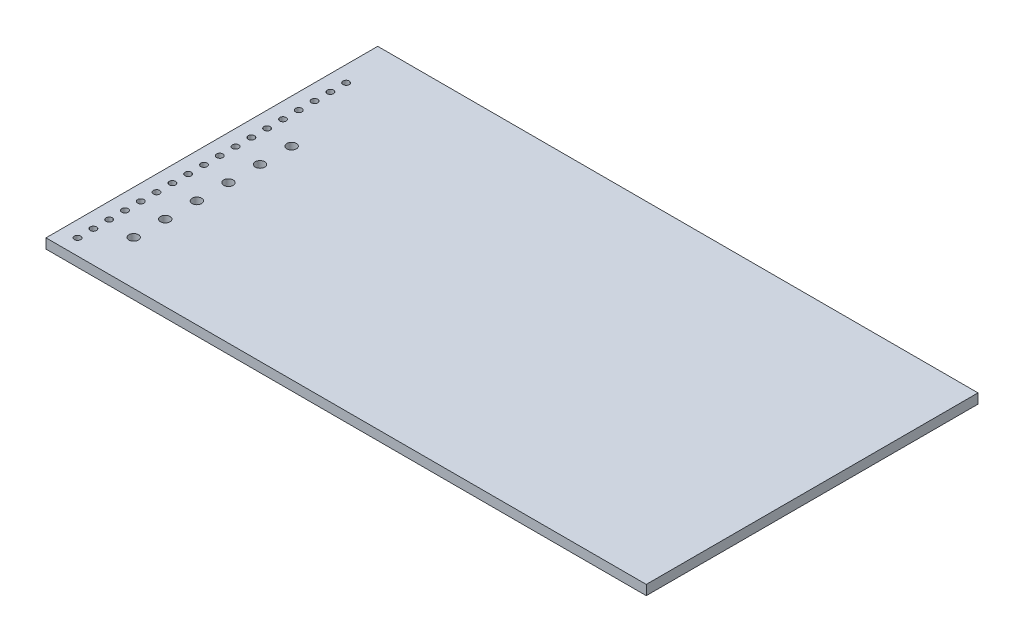
ISO-10303-21;
HEADER;
FILE_DESCRIPTION(('STEP AP214'),'2;1');
FILE_NAME('part.step','',(''),(''),'','','');
FILE_SCHEMA(('AUTOMOTIVE_DESIGN { 1 0 10303 214 1 1 1 1 }'));
ENDSEC;
DATA;
#1=APPLICATION_CONTEXT('core data for automotive mechanical design processes');
#2=APPLICATION_PROTOCOL_DEFINITION('international standard','automotive_design',2000,#1);
#3=PRODUCT_CONTEXT('',#1,'mechanical');
#4=PRODUCT('Part','Part','',(#3));
#5=PRODUCT_RELATED_PRODUCT_CATEGORY('part','',(#4));
#6=PRODUCT_DEFINITION_FORMATION('','',#4);
#7=PRODUCT_DEFINITION_CONTEXT('part definition',#1,'design');
#8=PRODUCT_DEFINITION('design','',#6,#7);
#9=PRODUCT_DEFINITION_SHAPE('','',#8);
#10=(LENGTH_UNIT() NAMED_UNIT(*) SI_UNIT(.MILLI.,.METRE.));
#11=(NAMED_UNIT(*) PLANE_ANGLE_UNIT() SI_UNIT($,.RADIAN.));
#12=(NAMED_UNIT(*) SI_UNIT($,.STERADIAN.) SOLID_ANGLE_UNIT());
#13=UNCERTAINTY_MEASURE_WITH_UNIT(LENGTH_MEASURE(1.E-05),#10,'distance_accuracy_value','');
#14=(GEOMETRIC_REPRESENTATION_CONTEXT(3) GLOBAL_UNCERTAINTY_ASSIGNED_CONTEXT((#13)) GLOBAL_UNIT_ASSIGNED_CONTEXT((#10,
#11,#12)) REPRESENTATION_CONTEXT('',''));
#15=CARTESIAN_POINT('',(0.,0.,0.));
#16=DIRECTION('',(0.,0.,1.));
#17=DIRECTION('',(1.,0.,0.));
#18=AXIS2_PLACEMENT_3D('',#15,#16,#17);
#19=CARTESIAN_POINT('',(0.,1.5748,0.));
#20=DIRECTION('',(1.,0.,0.));
#21=DIRECTION('',(0.,0.,-1.));
#22=AXIS2_PLACEMENT_3D('',#19,#20,#21);
#23=PLANE('',#22);
#24=DIRECTION('',(0.,0.,1.));
#25=VECTOR('',#24,1.);
#26=CARTESIAN_POINT('',(0.,0.,0.));
#27=LINE('',#26,#25);
#28=CARTESIAN_POINT('',(0.,0.,-53.34));
#29=VERTEX_POINT('',#28);
#30=CARTESIAN_POINT('',(0.,0.,0.));
#31=VERTEX_POINT('',#30);
#32=EDGE_CURVE('E96',#29,#31,#27,.T.);
#33=ORIENTED_EDGE('',*,*,#32,.T.);
#34=DIRECTION('',(0.,-1.,0.));
#35=VECTOR('',#34,1.);
#36=CARTESIAN_POINT('',(0.,1.5748,0.));
#37=LINE('',#36,#35);
#38=CARTESIAN_POINT('',(0.,1.5748,0.));
#39=VERTEX_POINT('',#38);
#40=EDGE_CURVE('E11',#39,#31,#37,.T.);
#41=ORIENTED_EDGE('',*,*,#40,.F.);
#42=DIRECTION('',(0.,0.,1.));
#43=VECTOR('',#42,1.);
#44=CARTESIAN_POINT('',(0.,1.5748,0.));
#45=LINE('',#44,#43);
#46=CARTESIAN_POINT('',(0.,1.5748,-53.34));
#47=VERTEX_POINT('',#46);
#48=EDGE_CURVE('E84',#47,#39,#45,.T.);
#49=ORIENTED_EDGE('',*,*,#48,.F.);
#50=DIRECTION('',(0.,-1.,0.));
#51=VECTOR('',#50,1.);
#52=CARTESIAN_POINT('',(0.,1.5748,-53.34));
#53=LINE('',#52,#51);
#54=EDGE_CURVE('E92',#47,#29,#53,.T.);
#55=ORIENTED_EDGE('',*,*,#54,.T.);
#56=EDGE_LOOP('',(#33,#41,#49,#55));
#57=FACE_BOUND('',#56,.T.);
#58=ADVANCED_FACE('F33',(#57),#23,.F.);
#59=CARTESIAN_POINT('',(0.,1.5748,0.));
#60=DIRECTION('',(0.,0.,-1.));
#61=DIRECTION('',(-1.,0.,0.));
#62=AXIS2_PLACEMENT_3D('',#59,#60,#61);
#63=PLANE('',#62);
#64=DIRECTION('',(1.,0.,0.));
#65=VECTOR('',#64,1.);
#66=CARTESIAN_POINT('',(0.,0.,0.));
#67=LINE('',#66,#65);
#68=CARTESIAN_POINT('',(96.52,0.,0.));
#69=VERTEX_POINT('',#68);
#70=EDGE_CURVE('E88',#31,#69,#67,.T.);
#71=ORIENTED_EDGE('',*,*,#70,.T.);
#72=DIRECTION('',(0.,-1.,0.));
#73=VECTOR('',#72,1.);
#74=CARTESIAN_POINT('',(96.52,1.5748,0.));
#75=LINE('',#74,#73);
#76=CARTESIAN_POINT('',(96.52,1.5748,0.));
#77=VERTEX_POINT('',#76);
#78=EDGE_CURVE('E41',#77,#69,#75,.T.);
#79=ORIENTED_EDGE('',*,*,#78,.F.);
#80=DIRECTION('',(1.,0.,0.));
#81=VECTOR('',#80,1.);
#82=CARTESIAN_POINT('',(0.,1.5748,0.));
#83=LINE('',#82,#81);
#84=EDGE_CURVE('E79',#39,#77,#83,.T.);
#85=ORIENTED_EDGE('',*,*,#84,.F.);
#86=ORIENTED_EDGE('',*,*,#40,.T.);
#87=EDGE_LOOP('',(#71,#79,#85,#86));
#88=FACE_BOUND('',#87,.T.);
#89=ADVANCED_FACE('F87',(#88),#63,.F.);
#90=CARTESIAN_POINT('',(96.52,1.5748,0.));
#91=DIRECTION('',(-1.,0.,0.));
#92=DIRECTION('',(0.,0.,1.));
#93=AXIS2_PLACEMENT_3D('',#90,#91,#92);
#94=PLANE('',#93);
#95=DIRECTION('',(0.,0.,-1.));
#96=VECTOR('',#95,1.);
#97=CARTESIAN_POINT('',(96.52,0.,0.));
#98=LINE('',#97,#96);
#99=CARTESIAN_POINT('',(96.52,0.,-53.34));
#100=VERTEX_POINT('',#99);
#101=EDGE_CURVE('E66',#69,#100,#98,.T.);
#102=ORIENTED_EDGE('',*,*,#101,.T.);
#103=DIRECTION('',(0.,-1.,0.));
#104=VECTOR('',#103,1.);
#105=CARTESIAN_POINT('',(96.52,1.5748,-53.34));
#106=LINE('',#105,#104);
#107=CARTESIAN_POINT('',(96.52,1.5748,-53.34));
#108=VERTEX_POINT('',#107);
#109=EDGE_CURVE('E89',#108,#100,#106,.T.);
#110=ORIENTED_EDGE('',*,*,#109,.F.);
#111=DIRECTION('',(0.,0.,-1.));
#112=VECTOR('',#111,1.);
#113=CARTESIAN_POINT('',(96.52,1.5748,0.));
#114=LINE('',#113,#112);
#115=EDGE_CURVE('E82',#77,#108,#114,.T.);
#116=ORIENTED_EDGE('',*,*,#115,.F.);
#117=ORIENTED_EDGE('',*,*,#78,.T.);
#118=EDGE_LOOP('',(#102,#110,#116,#117));
#119=FACE_BOUND('',#118,.T.);
#120=ADVANCED_FACE('F90',(#119),#94,.F.);
#121=CARTESIAN_POINT('',(0.,1.5748,-53.34));
#122=DIRECTION('',(0.,0.,1.));
#123=DIRECTION('',(1.,0.,0.));
#124=AXIS2_PLACEMENT_3D('',#121,#122,#123);
#125=PLANE('',#124);
#126=DIRECTION('',(-1.,0.,0.));
#127=VECTOR('',#126,1.);
#128=CARTESIAN_POINT('',(0.,0.,-53.34));
#129=LINE('',#128,#127);
#130=EDGE_CURVE('E72',#100,#29,#129,.T.);
#131=ORIENTED_EDGE('',*,*,#130,.T.);
#132=ORIENTED_EDGE('',*,*,#54,.F.);
#133=DIRECTION('',(-1.,0.,0.));
#134=VECTOR('',#133,1.);
#135=CARTESIAN_POINT('',(0.,1.5748,-53.34));
#136=LINE('',#135,#134);
#137=EDGE_CURVE('E49',#108,#47,#136,.T.);
#138=ORIENTED_EDGE('',*,*,#137,.F.);
#139=ORIENTED_EDGE('',*,*,#109,.T.);
#140=EDGE_LOOP('',(#131,#132,#138,#139));
#141=FACE_BOUND('',#140,.T.);
#142=ADVANCED_FACE('F104',(#141),#125,.F.);
#143=CARTESIAN_POINT('',(0.,1.5748,0.));
#144=DIRECTION('',(0.,-1.,0.));
#145=DIRECTION('',(0.,0.,-1.));
#146=AXIS2_PLACEMENT_3D('',#143,#144,#145);
#147=PLANE('',#146);
#148=CARTESIAN_POINT('',(6.985,1.5748,-32.512));
#149=DIRECTION('',(0.,1.,0.));
#150=DIRECTION('',(0.,0.,1.));
#151=AXIS2_PLACEMENT_3D('',#148,#149,#150);
#152=CIRCLE('',#151,0.761999999999915);
#153=CARTESIAN_POINT('',(6.985,1.5748,-31.7500000000001));
#154=VERTEX_POINT('',#153);
#155=EDGE_CURVE('E248',#154,#154,#152,.T.);
#156=ORIENTED_EDGE('',*,*,#155,.F.);
#157=EDGE_LOOP('',(#156));
#158=FACE_BOUND('',#157,.T.);
#159=CARTESIAN_POINT('',(6.98499999999993,1.5748,-27.432));
#160=DIRECTION('',(0.,1.,0.));
#161=DIRECTION('',(0.,0.,1.));
#162=AXIS2_PLACEMENT_3D('',#159,#160,#161);
#163=CIRCLE('',#162,0.761999999999999);
#164=CARTESIAN_POINT('',(6.98499999999993,1.5748,-26.67));
#165=VERTEX_POINT('',#164);
#166=EDGE_CURVE('E242',#165,#165,#163,.T.);
#167=ORIENTED_EDGE('',*,*,#166,.F.);
#168=EDGE_LOOP('',(#167));
#169=FACE_BOUND('',#168,.T.);
#170=CARTESIAN_POINT('',(6.98499999999995,1.5748,-22.352));
#171=DIRECTION('',(0.,1.,0.));
#172=DIRECTION('',(0.,0.,1.));
#173=AXIS2_PLACEMENT_3D('',#170,#171,#172);
#174=CIRCLE('',#173,0.761999999999999);
#175=CARTESIAN_POINT('',(6.98499999999995,1.5748,-21.59));
#176=VERTEX_POINT('',#175);
#177=EDGE_CURVE('E236',#176,#176,#174,.T.);
#178=ORIENTED_EDGE('',*,*,#177,.F.);
#179=EDGE_LOOP('',(#178));
#180=FACE_BOUND('',#179,.T.);
#181=CARTESIAN_POINT('',(6.98499999999996,1.5748,-17.272));
#182=DIRECTION('',(0.,1.,0.));
#183=DIRECTION('',(0.,0.,1.));
#184=AXIS2_PLACEMENT_3D('',#181,#182,#183);
#185=CIRCLE('',#184,0.761999999999999);
#186=CARTESIAN_POINT('',(6.98499999999996,1.5748,-16.51));
#187=VERTEX_POINT('',#186);
#188=EDGE_CURVE('E230',#187,#187,#185,.T.);
#189=ORIENTED_EDGE('',*,*,#188,.F.);
#190=EDGE_LOOP('',(#189));
#191=FACE_BOUND('',#190,.T.);
#192=CARTESIAN_POINT('',(6.98499999999998,1.5748,-12.192));
#193=DIRECTION('',(0.,1.,0.));
#194=DIRECTION('',(0.,0.,1.));
#195=AXIS2_PLACEMENT_3D('',#192,#193,#194);
#196=CIRCLE('',#195,0.761999999999999);
#197=CARTESIAN_POINT('',(6.98499999999998,1.5748,-11.43));
#198=VERTEX_POINT('',#197);
#199=EDGE_CURVE('E224',#198,#198,#196,.T.);
#200=ORIENTED_EDGE('',*,*,#199,.F.);
#201=EDGE_LOOP('',(#200));
#202=FACE_BOUND('',#201,.T.);
#203=CARTESIAN_POINT('',(2.54,1.5748,-45.72));
#204=DIRECTION('',(0.,1.,0.));
#205=DIRECTION('',(0.,0.,1.));
#206=AXIS2_PLACEMENT_3D('',#203,#204,#205);
#207=CIRCLE('',#206,0.507999999999857);
#208=CARTESIAN_POINT('',(2.54,1.5748,-45.2120000000001));
#209=VERTEX_POINT('',#208);
#210=EDGE_CURVE('E218',#209,#209,#207,.T.);
#211=ORIENTED_EDGE('',*,*,#210,.F.);
#212=EDGE_LOOP('',(#211));
#213=FACE_BOUND('',#212,.T.);
#214=CARTESIAN_POINT('',(6.985,1.5748,-7.112));
#215=DIRECTION('',(0.,1.,0.));
#216=DIRECTION('',(0.,0.,1.));
#217=AXIS2_PLACEMENT_3D('',#214,#215,#216);
#218=CIRCLE('',#217,0.761999999999999);
#219=CARTESIAN_POINT('',(6.985,1.5748,-6.35));
#220=VERTEX_POINT('',#219);
#221=EDGE_CURVE('E212',#220,#220,#218,.T.);
#222=ORIENTED_EDGE('',*,*,#221,.F.);
#223=EDGE_LOOP('',(#222));
#224=FACE_BOUND('',#223,.T.);
#225=CARTESIAN_POINT('',(2.53999999999986,1.5748,-43.18));
#226=DIRECTION('',(0.,1.,0.));
#227=DIRECTION('',(0.,0.,1.));
#228=AXIS2_PLACEMENT_3D('',#225,#226,#227);
#229=CIRCLE('',#228,0.507999999999999);
#230=CARTESIAN_POINT('',(2.53999999999986,1.5748,-42.672));
#231=VERTEX_POINT('',#230);
#232=EDGE_CURVE('E206',#231,#231,#229,.T.);
#233=ORIENTED_EDGE('',*,*,#232,.F.);
#234=EDGE_LOOP('',(#233));
#235=FACE_BOUND('',#234,.T.);
#236=CARTESIAN_POINT('',(2.53999999999987,1.5748,-40.64));
#237=DIRECTION('',(0.,1.,0.));
#238=DIRECTION('',(0.,0.,1.));
#239=AXIS2_PLACEMENT_3D('',#236,#237,#238);
#240=CIRCLE('',#239,0.507999999999999);
#241=CARTESIAN_POINT('',(2.53999999999987,1.5748,-40.132));
#242=VERTEX_POINT('',#241);
#243=EDGE_CURVE('E200',#242,#242,#240,.T.);
#244=ORIENTED_EDGE('',*,*,#243,.F.);
#245=EDGE_LOOP('',(#244));
#246=FACE_BOUND('',#245,.T.);
#247=CARTESIAN_POINT('',(2.53999999999988,1.5748,-38.1));
#248=DIRECTION('',(0.,1.,0.));
#249=DIRECTION('',(0.,0.,1.));
#250=AXIS2_PLACEMENT_3D('',#247,#248,#249);
#251=CIRCLE('',#250,0.507999999999999);
#252=CARTESIAN_POINT('',(2.53999999999988,1.5748,-37.592));
#253=VERTEX_POINT('',#252);
#254=EDGE_CURVE('E194',#253,#253,#251,.T.);
#255=ORIENTED_EDGE('',*,*,#254,.F.);
#256=EDGE_LOOP('',(#255));
#257=FACE_BOUND('',#256,.T.);
#258=CARTESIAN_POINT('',(2.53999999999989,1.5748,-35.56));
#259=DIRECTION('',(0.,1.,0.));
#260=DIRECTION('',(0.,0.,1.));
#261=AXIS2_PLACEMENT_3D('',#258,#259,#260);
#262=CIRCLE('',#261,0.507999999999999);
#263=CARTESIAN_POINT('',(2.53999999999989,1.5748,-35.052));
#264=VERTEX_POINT('',#263);
#265=EDGE_CURVE('E188',#264,#264,#262,.T.);
#266=ORIENTED_EDGE('',*,*,#265,.F.);
#267=EDGE_LOOP('',(#266));
#268=FACE_BOUND('',#267,.T.);
#269=CARTESIAN_POINT('',(2.53999999999989,1.5748,-33.02));
#270=DIRECTION('',(0.,1.,0.));
#271=DIRECTION('',(0.,0.,1.));
#272=AXIS2_PLACEMENT_3D('',#269,#270,#271);
#273=CIRCLE('',#272,0.507999999999999);
#274=CARTESIAN_POINT('',(2.53999999999989,1.5748,-32.512));
#275=VERTEX_POINT('',#274);
#276=EDGE_CURVE('E182',#275,#275,#273,.T.);
#277=ORIENTED_EDGE('',*,*,#276,.F.);
#278=EDGE_LOOP('',(#277));
#279=FACE_BOUND('',#278,.T.);
#280=CARTESIAN_POINT('',(2.5399999999999,1.5748,-30.48));
#281=DIRECTION('',(0.,1.,0.));
#282=DIRECTION('',(0.,0.,1.));
#283=AXIS2_PLACEMENT_3D('',#280,#281,#282);
#284=CIRCLE('',#283,0.508);
#285=CARTESIAN_POINT('',(2.5399999999999,1.5748,-29.972));
#286=VERTEX_POINT('',#285);
#287=EDGE_CURVE('E176',#286,#286,#284,.T.);
#288=ORIENTED_EDGE('',*,*,#287,.F.);
#289=EDGE_LOOP('',(#288));
#290=FACE_BOUND('',#289,.T.);
#291=CARTESIAN_POINT('',(2.53999999999991,1.5748,-27.94));
#292=DIRECTION('',(0.,1.,0.));
#293=DIRECTION('',(0.,0.,1.));
#294=AXIS2_PLACEMENT_3D('',#291,#292,#293);
#295=CIRCLE('',#294,0.508);
#296=CARTESIAN_POINT('',(2.53999999999991,1.5748,-27.432));
#297=VERTEX_POINT('',#296);
#298=EDGE_CURVE('E170',#297,#297,#295,.T.);
#299=ORIENTED_EDGE('',*,*,#298,.F.);
#300=EDGE_LOOP('',(#299));
#301=FACE_BOUND('',#300,.T.);
#302=CARTESIAN_POINT('',(2.53999999999992,1.5748,-25.4));
#303=DIRECTION('',(0.,1.,0.));
#304=DIRECTION('',(0.,0.,1.));
#305=AXIS2_PLACEMENT_3D('',#302,#303,#304);
#306=CIRCLE('',#305,0.508);
#307=CARTESIAN_POINT('',(2.53999999999992,1.5748,-24.892));
#308=VERTEX_POINT('',#307);
#309=EDGE_CURVE('E164',#308,#308,#306,.T.);
#310=ORIENTED_EDGE('',*,*,#309,.F.);
#311=EDGE_LOOP('',(#310));
#312=FACE_BOUND('',#311,.T.);
#313=CARTESIAN_POINT('',(2.53999999999993,1.5748,-22.86));
#314=DIRECTION('',(0.,1.,0.));
#315=DIRECTION('',(0.,0.,1.));
#316=AXIS2_PLACEMENT_3D('',#313,#314,#315);
#317=CIRCLE('',#316,0.508);
#318=CARTESIAN_POINT('',(2.53999999999993,1.5748,-22.352));
#319=VERTEX_POINT('',#318);
#320=EDGE_CURVE('E158',#319,#319,#317,.T.);
#321=ORIENTED_EDGE('',*,*,#320,.F.);
#322=EDGE_LOOP('',(#321));
#323=FACE_BOUND('',#322,.T.);
#324=CARTESIAN_POINT('',(2.53999999999994,1.5748,-20.32));
#325=DIRECTION('',(0.,1.,0.));
#326=DIRECTION('',(0.,0.,1.));
#327=AXIS2_PLACEMENT_3D('',#324,#325,#326);
#328=CIRCLE('',#327,0.508);
#329=CARTESIAN_POINT('',(2.53999999999994,1.5748,-19.812));
#330=VERTEX_POINT('',#329);
#331=EDGE_CURVE('E152',#330,#330,#328,.T.);
#332=ORIENTED_EDGE('',*,*,#331,.F.);
#333=EDGE_LOOP('',(#332));
#334=FACE_BOUND('',#333,.T.);
#335=CARTESIAN_POINT('',(2.53999999999995,1.5748,-17.78));
#336=DIRECTION('',(0.,1.,0.));
#337=DIRECTION('',(0.,0.,1.));
#338=AXIS2_PLACEMENT_3D('',#335,#336,#337);
#339=CIRCLE('',#338,0.508);
#340=CARTESIAN_POINT('',(2.53999999999995,1.5748,-17.272));
#341=VERTEX_POINT('',#340);
#342=EDGE_CURVE('E146',#341,#341,#339,.T.);
#343=ORIENTED_EDGE('',*,*,#342,.F.);
#344=EDGE_LOOP('',(#343));
#345=FACE_BOUND('',#344,.T.);
#346=CARTESIAN_POINT('',(2.53999999999996,1.5748,-15.24));
#347=DIRECTION('',(0.,1.,0.));
#348=DIRECTION('',(0.,0.,1.));
#349=AXIS2_PLACEMENT_3D('',#346,#347,#348);
#350=CIRCLE('',#349,0.508);
#351=CARTESIAN_POINT('',(2.53999999999996,1.5748,-14.732));
#352=VERTEX_POINT('',#351);
#353=EDGE_CURVE('E140',#352,#352,#350,.T.);
#354=ORIENTED_EDGE('',*,*,#353,.F.);
#355=EDGE_LOOP('',(#354));
#356=FACE_BOUND('',#355,.T.);
#357=CARTESIAN_POINT('',(2.53999999999996,1.5748,-12.7));
#358=DIRECTION('',(0.,1.,0.));
#359=DIRECTION('',(0.,0.,1.));
#360=AXIS2_PLACEMENT_3D('',#357,#358,#359);
#361=CIRCLE('',#360,0.508);
#362=CARTESIAN_POINT('',(2.53999999999996,1.5748,-12.192));
#363=VERTEX_POINT('',#362);
#364=EDGE_CURVE('E134',#363,#363,#361,.T.);
#365=ORIENTED_EDGE('',*,*,#364,.F.);
#366=EDGE_LOOP('',(#365));
#367=FACE_BOUND('',#366,.T.);
#368=CARTESIAN_POINT('',(2.53999999999997,1.5748,-10.16));
#369=DIRECTION('',(0.,1.,0.));
#370=DIRECTION('',(0.,0.,1.));
#371=AXIS2_PLACEMENT_3D('',#368,#369,#370);
#372=CIRCLE('',#371,0.508);
#373=CARTESIAN_POINT('',(2.53999999999997,1.5748,-9.652));
#374=VERTEX_POINT('',#373);
#375=EDGE_CURVE('E128',#374,#374,#372,.T.);
#376=ORIENTED_EDGE('',*,*,#375,.F.);
#377=EDGE_LOOP('',(#376));
#378=FACE_BOUND('',#377,.T.);
#379=CARTESIAN_POINT('',(2.53999999999998,1.5748,-7.62));
#380=DIRECTION('',(0.,1.,0.));
#381=DIRECTION('',(0.,0.,1.));
#382=AXIS2_PLACEMENT_3D('',#379,#380,#381);
#383=CIRCLE('',#382,0.508);
#384=CARTESIAN_POINT('',(2.53999999999998,1.5748,-7.112));
#385=VERTEX_POINT('',#384);
#386=EDGE_CURVE('E122',#385,#385,#383,.T.);
#387=ORIENTED_EDGE('',*,*,#386,.F.);
#388=EDGE_LOOP('',(#387));
#389=FACE_BOUND('',#388,.T.);
#390=CARTESIAN_POINT('',(2.53999999999999,1.5748,-5.08));
#391=DIRECTION('',(0.,1.,0.));
#392=DIRECTION('',(0.,0.,1.));
#393=AXIS2_PLACEMENT_3D('',#390,#391,#392);
#394=CIRCLE('',#393,0.508);
#395=CARTESIAN_POINT('',(2.53999999999999,1.5748,-4.572));
#396=VERTEX_POINT('',#395);
#397=EDGE_CURVE('E116',#396,#396,#394,.T.);
#398=ORIENTED_EDGE('',*,*,#397,.F.);
#399=EDGE_LOOP('',(#398));
#400=FACE_BOUND('',#399,.T.);
#401=CARTESIAN_POINT('',(2.54,1.5748,-2.54));
#402=DIRECTION('',(0.,1.,0.));
#403=DIRECTION('',(0.,0.,1.));
#404=AXIS2_PLACEMENT_3D('',#401,#402,#403);
#405=CIRCLE('',#404,0.508);
#406=CARTESIAN_POINT('',(2.54,1.5748,-2.032));
#407=VERTEX_POINT('',#406);
#408=EDGE_CURVE('E110',#407,#407,#405,.T.);
#409=ORIENTED_EDGE('',*,*,#408,.F.);
#410=EDGE_LOOP('',(#409));
#411=FACE_BOUND('',#410,.T.);
#412=ORIENTED_EDGE('',*,*,#48,.T.);
#413=ORIENTED_EDGE('',*,*,#84,.T.);
#414=ORIENTED_EDGE('',*,*,#115,.T.);
#415=ORIENTED_EDGE('',*,*,#137,.T.);
#416=EDGE_LOOP('',(#412,#413,#414,#415));
#417=FACE_BOUND('',#416,.T.);
#418=ADVANCED_FACE('F80',(#158,#169,#180,#191,#202,#213,#224,#235,#246,#257,#268,#279,#290,#301,
#312,#323,#334,#345,#356,#367,#378,#389,#400,#411,#417),#147,.F.);
#419=CARTESIAN_POINT('',(0.,0.,0.));
#420=DIRECTION('',(0.,-1.,0.));
#421=DIRECTION('',(0.,0.,-1.));
#422=AXIS2_PLACEMENT_3D('',#419,#420,#421);
#423=PLANE('',#422);
#424=CARTESIAN_POINT('',(6.985,0.,-32.512));
#425=DIRECTION('',(0.,1.,0.));
#426=DIRECTION('',(0.,0.,1.));
#427=AXIS2_PLACEMENT_3D('',#424,#425,#426);
#428=CIRCLE('',#427,0.761999999999915);
#429=CARTESIAN_POINT('',(6.985,0.,-31.7500000000001));
#430=VERTEX_POINT('',#429);
#431=EDGE_CURVE('E245',#430,#430,#428,.T.);
#432=ORIENTED_EDGE('',*,*,#431,.T.);
#433=EDGE_LOOP('',(#432));
#434=FACE_BOUND('',#433,.T.);
#435=CARTESIAN_POINT('',(6.98499999999993,0.,-27.432));
#436=DIRECTION('',(0.,1.,0.));
#437=DIRECTION('',(0.,0.,1.));
#438=AXIS2_PLACEMENT_3D('',#435,#436,#437);
#439=CIRCLE('',#438,0.761999999999999);
#440=CARTESIAN_POINT('',(6.98499999999993,0.,-26.67));
#441=VERTEX_POINT('',#440);
#442=EDGE_CURVE('E239',#441,#441,#439,.T.);
#443=ORIENTED_EDGE('',*,*,#442,.T.);
#444=EDGE_LOOP('',(#443));
#445=FACE_BOUND('',#444,.T.);
#446=CARTESIAN_POINT('',(6.98499999999995,0.,-22.352));
#447=DIRECTION('',(0.,1.,0.));
#448=DIRECTION('',(0.,0.,1.));
#449=AXIS2_PLACEMENT_3D('',#446,#447,#448);
#450=CIRCLE('',#449,0.761999999999999);
#451=CARTESIAN_POINT('',(6.98499999999995,0.,-21.59));
#452=VERTEX_POINT('',#451);
#453=EDGE_CURVE('E233',#452,#452,#450,.T.);
#454=ORIENTED_EDGE('',*,*,#453,.T.);
#455=EDGE_LOOP('',(#454));
#456=FACE_BOUND('',#455,.T.);
#457=CARTESIAN_POINT('',(6.98499999999996,0.,-17.272));
#458=DIRECTION('',(0.,1.,0.));
#459=DIRECTION('',(0.,0.,1.));
#460=AXIS2_PLACEMENT_3D('',#457,#458,#459);
#461=CIRCLE('',#460,0.761999999999999);
#462=CARTESIAN_POINT('',(6.98499999999996,0.,-16.51));
#463=VERTEX_POINT('',#462);
#464=EDGE_CURVE('E227',#463,#463,#461,.T.);
#465=ORIENTED_EDGE('',*,*,#464,.T.);
#466=EDGE_LOOP('',(#465));
#467=FACE_BOUND('',#466,.T.);
#468=CARTESIAN_POINT('',(6.98499999999998,0.,-12.192));
#469=DIRECTION('',(0.,1.,0.));
#470=DIRECTION('',(0.,0.,1.));
#471=AXIS2_PLACEMENT_3D('',#468,#469,#470);
#472=CIRCLE('',#471,0.761999999999999);
#473=CARTESIAN_POINT('',(6.98499999999998,0.,-11.43));
#474=VERTEX_POINT('',#473);
#475=EDGE_CURVE('E221',#474,#474,#472,.T.);
#476=ORIENTED_EDGE('',*,*,#475,.T.);
#477=EDGE_LOOP('',(#476));
#478=FACE_BOUND('',#477,.T.);
#479=CARTESIAN_POINT('',(2.54,0.,-45.72));
#480=DIRECTION('',(0.,1.,0.));
#481=DIRECTION('',(0.,0.,1.));
#482=AXIS2_PLACEMENT_3D('',#479,#480,#481);
#483=CIRCLE('',#482,0.507999999999857);
#484=CARTESIAN_POINT('',(2.54,0.,-45.2120000000001));
#485=VERTEX_POINT('',#484);
#486=EDGE_CURVE('E215',#485,#485,#483,.T.);
#487=ORIENTED_EDGE('',*,*,#486,.T.);
#488=EDGE_LOOP('',(#487));
#489=FACE_BOUND('',#488,.T.);
#490=CARTESIAN_POINT('',(6.985,0.,-7.112));
#491=DIRECTION('',(0.,1.,0.));
#492=DIRECTION('',(0.,0.,1.));
#493=AXIS2_PLACEMENT_3D('',#490,#491,#492);
#494=CIRCLE('',#493,0.761999999999999);
#495=CARTESIAN_POINT('',(6.985,0.,-6.35));
#496=VERTEX_POINT('',#495);
#497=EDGE_CURVE('E209',#496,#496,#494,.T.);
#498=ORIENTED_EDGE('',*,*,#497,.T.);
#499=EDGE_LOOP('',(#498));
#500=FACE_BOUND('',#499,.T.);
#501=CARTESIAN_POINT('',(2.53999999999986,0.,-43.18));
#502=DIRECTION('',(0.,1.,0.));
#503=DIRECTION('',(0.,0.,1.));
#504=AXIS2_PLACEMENT_3D('',#501,#502,#503);
#505=CIRCLE('',#504,0.507999999999999);
#506=CARTESIAN_POINT('',(2.53999999999986,0.,-42.672));
#507=VERTEX_POINT('',#506);
#508=EDGE_CURVE('E203',#507,#507,#505,.T.);
#509=ORIENTED_EDGE('',*,*,#508,.T.);
#510=EDGE_LOOP('',(#509));
#511=FACE_BOUND('',#510,.T.);
#512=CARTESIAN_POINT('',(2.53999999999987,0.,-40.64));
#513=DIRECTION('',(0.,1.,0.));
#514=DIRECTION('',(0.,0.,1.));
#515=AXIS2_PLACEMENT_3D('',#512,#513,#514);
#516=CIRCLE('',#515,0.507999999999999);
#517=CARTESIAN_POINT('',(2.53999999999987,0.,-40.132));
#518=VERTEX_POINT('',#517);
#519=EDGE_CURVE('E197',#518,#518,#516,.T.);
#520=ORIENTED_EDGE('',*,*,#519,.T.);
#521=EDGE_LOOP('',(#520));
#522=FACE_BOUND('',#521,.T.);
#523=CARTESIAN_POINT('',(2.53999999999988,0.,-38.1));
#524=DIRECTION('',(0.,1.,0.));
#525=DIRECTION('',(0.,0.,1.));
#526=AXIS2_PLACEMENT_3D('',#523,#524,#525);
#527=CIRCLE('',#526,0.507999999999999);
#528=CARTESIAN_POINT('',(2.53999999999988,0.,-37.592));
#529=VERTEX_POINT('',#528);
#530=EDGE_CURVE('E191',#529,#529,#527,.T.);
#531=ORIENTED_EDGE('',*,*,#530,.T.);
#532=EDGE_LOOP('',(#531));
#533=FACE_BOUND('',#532,.T.);
#534=CARTESIAN_POINT('',(2.53999999999989,0.,-35.56));
#535=DIRECTION('',(0.,1.,0.));
#536=DIRECTION('',(0.,0.,1.));
#537=AXIS2_PLACEMENT_3D('',#534,#535,#536);
#538=CIRCLE('',#537,0.507999999999999);
#539=CARTESIAN_POINT('',(2.53999999999989,0.,-35.052));
#540=VERTEX_POINT('',#539);
#541=EDGE_CURVE('E185',#540,#540,#538,.T.);
#542=ORIENTED_EDGE('',*,*,#541,.T.);
#543=EDGE_LOOP('',(#542));
#544=FACE_BOUND('',#543,.T.);
#545=CARTESIAN_POINT('',(2.53999999999989,0.,-33.02));
#546=DIRECTION('',(0.,1.,0.));
#547=DIRECTION('',(0.,0.,1.));
#548=AXIS2_PLACEMENT_3D('',#545,#546,#547);
#549=CIRCLE('',#548,0.507999999999999);
#550=CARTESIAN_POINT('',(2.53999999999989,0.,-32.512));
#551=VERTEX_POINT('',#550);
#552=EDGE_CURVE('E179',#551,#551,#549,.T.);
#553=ORIENTED_EDGE('',*,*,#552,.T.);
#554=EDGE_LOOP('',(#553));
#555=FACE_BOUND('',#554,.T.);
#556=CARTESIAN_POINT('',(2.5399999999999,0.,-30.48));
#557=DIRECTION('',(0.,1.,0.));
#558=DIRECTION('',(0.,0.,1.));
#559=AXIS2_PLACEMENT_3D('',#556,#557,#558);
#560=CIRCLE('',#559,0.508);
#561=CARTESIAN_POINT('',(2.5399999999999,0.,-29.972));
#562=VERTEX_POINT('',#561);
#563=EDGE_CURVE('E173',#562,#562,#560,.T.);
#564=ORIENTED_EDGE('',*,*,#563,.T.);
#565=EDGE_LOOP('',(#564));
#566=FACE_BOUND('',#565,.T.);
#567=CARTESIAN_POINT('',(2.53999999999991,0.,-27.94));
#568=DIRECTION('',(0.,1.,0.));
#569=DIRECTION('',(0.,0.,1.));
#570=AXIS2_PLACEMENT_3D('',#567,#568,#569);
#571=CIRCLE('',#570,0.508);
#572=CARTESIAN_POINT('',(2.53999999999991,0.,-27.432));
#573=VERTEX_POINT('',#572);
#574=EDGE_CURVE('E167',#573,#573,#571,.T.);
#575=ORIENTED_EDGE('',*,*,#574,.T.);
#576=EDGE_LOOP('',(#575));
#577=FACE_BOUND('',#576,.T.);
#578=CARTESIAN_POINT('',(2.53999999999992,0.,-25.4));
#579=DIRECTION('',(0.,1.,0.));
#580=DIRECTION('',(0.,0.,1.));
#581=AXIS2_PLACEMENT_3D('',#578,#579,#580);
#582=CIRCLE('',#581,0.508);
#583=CARTESIAN_POINT('',(2.53999999999992,0.,-24.892));
#584=VERTEX_POINT('',#583);
#585=EDGE_CURVE('E161',#584,#584,#582,.T.);
#586=ORIENTED_EDGE('',*,*,#585,.T.);
#587=EDGE_LOOP('',(#586));
#588=FACE_BOUND('',#587,.T.);
#589=CARTESIAN_POINT('',(2.53999999999993,0.,-22.86));
#590=DIRECTION('',(0.,1.,0.));
#591=DIRECTION('',(0.,0.,1.));
#592=AXIS2_PLACEMENT_3D('',#589,#590,#591);
#593=CIRCLE('',#592,0.508);
#594=CARTESIAN_POINT('',(2.53999999999993,0.,-22.352));
#595=VERTEX_POINT('',#594);
#596=EDGE_CURVE('E155',#595,#595,#593,.T.);
#597=ORIENTED_EDGE('',*,*,#596,.T.);
#598=EDGE_LOOP('',(#597));
#599=FACE_BOUND('',#598,.T.);
#600=CARTESIAN_POINT('',(2.53999999999994,0.,-20.32));
#601=DIRECTION('',(0.,1.,0.));
#602=DIRECTION('',(0.,0.,1.));
#603=AXIS2_PLACEMENT_3D('',#600,#601,#602);
#604=CIRCLE('',#603,0.508);
#605=CARTESIAN_POINT('',(2.53999999999994,0.,-19.812));
#606=VERTEX_POINT('',#605);
#607=EDGE_CURVE('E149',#606,#606,#604,.T.);
#608=ORIENTED_EDGE('',*,*,#607,.T.);
#609=EDGE_LOOP('',(#608));
#610=FACE_BOUND('',#609,.T.);
#611=CARTESIAN_POINT('',(2.53999999999995,0.,-17.78));
#612=DIRECTION('',(0.,1.,0.));
#613=DIRECTION('',(0.,0.,1.));
#614=AXIS2_PLACEMENT_3D('',#611,#612,#613);
#615=CIRCLE('',#614,0.508);
#616=CARTESIAN_POINT('',(2.53999999999995,0.,-17.272));
#617=VERTEX_POINT('',#616);
#618=EDGE_CURVE('E143',#617,#617,#615,.T.);
#619=ORIENTED_EDGE('',*,*,#618,.T.);
#620=EDGE_LOOP('',(#619));
#621=FACE_BOUND('',#620,.T.);
#622=CARTESIAN_POINT('',(2.53999999999996,0.,-15.24));
#623=DIRECTION('',(0.,1.,0.));
#624=DIRECTION('',(0.,0.,1.));
#625=AXIS2_PLACEMENT_3D('',#622,#623,#624);
#626=CIRCLE('',#625,0.508);
#627=CARTESIAN_POINT('',(2.53999999999996,0.,-14.732));
#628=VERTEX_POINT('',#627);
#629=EDGE_CURVE('E137',#628,#628,#626,.T.);
#630=ORIENTED_EDGE('',*,*,#629,.T.);
#631=EDGE_LOOP('',(#630));
#632=FACE_BOUND('',#631,.T.);
#633=CARTESIAN_POINT('',(2.53999999999996,0.,-12.7));
#634=DIRECTION('',(0.,1.,0.));
#635=DIRECTION('',(0.,0.,1.));
#636=AXIS2_PLACEMENT_3D('',#633,#634,#635);
#637=CIRCLE('',#636,0.508);
#638=CARTESIAN_POINT('',(2.53999999999996,0.,-12.192));
#639=VERTEX_POINT('',#638);
#640=EDGE_CURVE('E131',#639,#639,#637,.T.);
#641=ORIENTED_EDGE('',*,*,#640,.T.);
#642=EDGE_LOOP('',(#641));
#643=FACE_BOUND('',#642,.T.);
#644=CARTESIAN_POINT('',(2.53999999999997,0.,-10.16));
#645=DIRECTION('',(0.,1.,0.));
#646=DIRECTION('',(0.,0.,1.));
#647=AXIS2_PLACEMENT_3D('',#644,#645,#646);
#648=CIRCLE('',#647,0.508);
#649=CARTESIAN_POINT('',(2.53999999999997,0.,-9.652));
#650=VERTEX_POINT('',#649);
#651=EDGE_CURVE('E125',#650,#650,#648,.T.);
#652=ORIENTED_EDGE('',*,*,#651,.T.);
#653=EDGE_LOOP('',(#652));
#654=FACE_BOUND('',#653,.T.);
#655=CARTESIAN_POINT('',(2.53999999999998,0.,-7.62));
#656=DIRECTION('',(0.,1.,0.));
#657=DIRECTION('',(0.,0.,1.));
#658=AXIS2_PLACEMENT_3D('',#655,#656,#657);
#659=CIRCLE('',#658,0.508);
#660=CARTESIAN_POINT('',(2.53999999999998,0.,-7.112));
#661=VERTEX_POINT('',#660);
#662=EDGE_CURVE('E119',#661,#661,#659,.T.);
#663=ORIENTED_EDGE('',*,*,#662,.T.);
#664=EDGE_LOOP('',(#663));
#665=FACE_BOUND('',#664,.T.);
#666=CARTESIAN_POINT('',(2.53999999999999,0.,-5.08));
#667=DIRECTION('',(0.,1.,0.));
#668=DIRECTION('',(0.,0.,1.));
#669=AXIS2_PLACEMENT_3D('',#666,#667,#668);
#670=CIRCLE('',#669,0.508);
#671=CARTESIAN_POINT('',(2.53999999999999,0.,-4.572));
#672=VERTEX_POINT('',#671);
#673=EDGE_CURVE('E113',#672,#672,#670,.T.);
#674=ORIENTED_EDGE('',*,*,#673,.T.);
#675=EDGE_LOOP('',(#674));
#676=FACE_BOUND('',#675,.T.);
#677=CARTESIAN_POINT('',(2.54,0.,-2.54));
#678=DIRECTION('',(0.,1.,0.));
#679=DIRECTION('',(0.,0.,1.));
#680=AXIS2_PLACEMENT_3D('',#677,#678,#679);
#681=CIRCLE('',#680,0.508);
#682=CARTESIAN_POINT('',(2.54,0.,-2.032));
#683=VERTEX_POINT('',#682);
#684=EDGE_CURVE('E99',#683,#683,#681,.T.);
#685=ORIENTED_EDGE('',*,*,#684,.T.);
#686=EDGE_LOOP('',(#685));
#687=FACE_BOUND('',#686,.T.);
#688=ORIENTED_EDGE('',*,*,#32,.F.);
#689=ORIENTED_EDGE('',*,*,#130,.F.);
#690=ORIENTED_EDGE('',*,*,#101,.F.);
#691=ORIENTED_EDGE('',*,*,#70,.F.);
#692=EDGE_LOOP('',(#688,#689,#690,#691));
#693=FACE_BOUND('',#692,.T.);
#694=ADVANCED_FACE('F107',(#434,#445,#456,#467,#478,#489,#500,#511,#522,#533,#544,#555,#566,
#577,#588,#599,#610,#621,#632,#643,#654,#665,#676,#687,#693),#423,.T.);
#695=CARTESIAN_POINT('',(2.54,0.,-2.54));
#696=DIRECTION('',(0.,1.,0.));
#697=DIRECTION('',(0.,0.,1.));
#698=AXIS2_PLACEMENT_3D('',#695,#696,#697);
#699=CYLINDRICAL_SURFACE('',#698,0.508);
#700=ORIENTED_EDGE('',*,*,#684,.F.);
#701=EDGE_LOOP('',(#700));
#702=FACE_BOUND('',#701,.T.);
#703=ORIENTED_EDGE('',*,*,#408,.T.);
#704=EDGE_LOOP('',(#703));
#705=FACE_BOUND('',#704,.T.);
#706=ADVANCED_FACE('F312',(#702,#705),#699,.F.);
#707=CARTESIAN_POINT('',(2.53999999999999,0.,-5.08));
#708=DIRECTION('',(0.,1.,0.));
#709=DIRECTION('',(0.,0.,1.));
#710=AXIS2_PLACEMENT_3D('',#707,#708,#709);
#711=CYLINDRICAL_SURFACE('',#710,0.508);
#712=ORIENTED_EDGE('',*,*,#673,.F.);
#713=EDGE_LOOP('',(#712));
#714=FACE_BOUND('',#713,.T.);
#715=ORIENTED_EDGE('',*,*,#397,.T.);
#716=EDGE_LOOP('',(#715));
#717=FACE_BOUND('',#716,.T.);
#718=ADVANCED_FACE('F314',(#714,#717),#711,.F.);
#719=CARTESIAN_POINT('',(2.53999999999998,0.,-7.62));
#720=DIRECTION('',(0.,1.,0.));
#721=DIRECTION('',(0.,0.,1.));
#722=AXIS2_PLACEMENT_3D('',#719,#720,#721);
#723=CYLINDRICAL_SURFACE('',#722,0.508);
#724=ORIENTED_EDGE('',*,*,#662,.F.);
#725=EDGE_LOOP('',(#724));
#726=FACE_BOUND('',#725,.T.);
#727=ORIENTED_EDGE('',*,*,#386,.T.);
#728=EDGE_LOOP('',(#727));
#729=FACE_BOUND('',#728,.T.);
#730=ADVANCED_FACE('F321',(#726,#729),#723,.F.);
#731=CARTESIAN_POINT('',(2.53999999999997,0.,-10.16));
#732=DIRECTION('',(0.,1.,0.));
#733=DIRECTION('',(0.,0.,1.));
#734=AXIS2_PLACEMENT_3D('',#731,#732,#733);
#735=CYLINDRICAL_SURFACE('',#734,0.508);
#736=ORIENTED_EDGE('',*,*,#651,.F.);
#737=EDGE_LOOP('',(#736));
#738=FACE_BOUND('',#737,.T.);
#739=ORIENTED_EDGE('',*,*,#375,.T.);
#740=EDGE_LOOP('',(#739));
#741=FACE_BOUND('',#740,.T.);
#742=ADVANCED_FACE('F367',(#738,#741),#735,.F.);
#743=CARTESIAN_POINT('',(2.53999999999996,0.,-12.7));
#744=DIRECTION('',(0.,1.,0.));
#745=DIRECTION('',(0.,0.,1.));
#746=AXIS2_PLACEMENT_3D('',#743,#744,#745);
#747=CYLINDRICAL_SURFACE('',#746,0.508);
#748=ORIENTED_EDGE('',*,*,#640,.F.);
#749=EDGE_LOOP('',(#748));
#750=FACE_BOUND('',#749,.T.);
#751=ORIENTED_EDGE('',*,*,#364,.T.);
#752=EDGE_LOOP('',(#751));
#753=FACE_BOUND('',#752,.T.);
#754=ADVANCED_FACE('F377',(#750,#753),#747,.F.);
#755=CARTESIAN_POINT('',(2.53999999999996,0.,-15.24));
#756=DIRECTION('',(0.,1.,0.));
#757=DIRECTION('',(0.,0.,1.));
#758=AXIS2_PLACEMENT_3D('',#755,#756,#757);
#759=CYLINDRICAL_SURFACE('',#758,0.508);
#760=ORIENTED_EDGE('',*,*,#629,.F.);
#761=EDGE_LOOP('',(#760));
#762=FACE_BOUND('',#761,.T.);
#763=ORIENTED_EDGE('',*,*,#353,.T.);
#764=EDGE_LOOP('',(#763));
#765=FACE_BOUND('',#764,.T.);
#766=ADVANCED_FACE('F387',(#762,#765),#759,.F.);
#767=CARTESIAN_POINT('',(2.53999999999995,0.,-17.78));
#768=DIRECTION('',(0.,1.,0.));
#769=DIRECTION('',(0.,0.,1.));
#770=AXIS2_PLACEMENT_3D('',#767,#768,#769);
#771=CYLINDRICAL_SURFACE('',#770,0.508);
#772=ORIENTED_EDGE('',*,*,#618,.F.);
#773=EDGE_LOOP('',(#772));
#774=FACE_BOUND('',#773,.T.);
#775=ORIENTED_EDGE('',*,*,#342,.T.);
#776=EDGE_LOOP('',(#775));
#777=FACE_BOUND('',#776,.T.);
#778=ADVANCED_FACE('F397',(#774,#777),#771,.F.);
#779=CARTESIAN_POINT('',(2.53999999999994,0.,-20.32));
#780=DIRECTION('',(0.,1.,0.));
#781=DIRECTION('',(0.,0.,1.));
#782=AXIS2_PLACEMENT_3D('',#779,#780,#781);
#783=CYLINDRICAL_SURFACE('',#782,0.508);
#784=ORIENTED_EDGE('',*,*,#607,.F.);
#785=EDGE_LOOP('',(#784));
#786=FACE_BOUND('',#785,.T.);
#787=ORIENTED_EDGE('',*,*,#331,.T.);
#788=EDGE_LOOP('',(#787));
#789=FACE_BOUND('',#788,.T.);
#790=ADVANCED_FACE('F407',(#786,#789),#783,.F.);
#791=CARTESIAN_POINT('',(2.53999999999993,0.,-22.86));
#792=DIRECTION('',(0.,1.,0.));
#793=DIRECTION('',(0.,0.,1.));
#794=AXIS2_PLACEMENT_3D('',#791,#792,#793);
#795=CYLINDRICAL_SURFACE('',#794,0.508);
#796=ORIENTED_EDGE('',*,*,#596,.F.);
#797=EDGE_LOOP('',(#796));
#798=FACE_BOUND('',#797,.T.);
#799=ORIENTED_EDGE('',*,*,#320,.T.);
#800=EDGE_LOOP('',(#799));
#801=FACE_BOUND('',#800,.T.);
#802=ADVANCED_FACE('F417',(#798,#801),#795,.F.);
#803=CARTESIAN_POINT('',(2.53999999999992,0.,-25.4));
#804=DIRECTION('',(0.,1.,0.));
#805=DIRECTION('',(0.,0.,1.));
#806=AXIS2_PLACEMENT_3D('',#803,#804,#805);
#807=CYLINDRICAL_SURFACE('',#806,0.508);
#808=ORIENTED_EDGE('',*,*,#585,.F.);
#809=EDGE_LOOP('',(#808));
#810=FACE_BOUND('',#809,.T.);
#811=ORIENTED_EDGE('',*,*,#309,.T.);
#812=EDGE_LOOP('',(#811));
#813=FACE_BOUND('',#812,.T.);
#814=ADVANCED_FACE('F427',(#810,#813),#807,.F.);
#815=CARTESIAN_POINT('',(2.53999999999991,0.,-27.94));
#816=DIRECTION('',(0.,1.,0.));
#817=DIRECTION('',(0.,0.,1.));
#818=AXIS2_PLACEMENT_3D('',#815,#816,#817);
#819=CYLINDRICAL_SURFACE('',#818,0.508);
#820=ORIENTED_EDGE('',*,*,#574,.F.);
#821=EDGE_LOOP('',(#820));
#822=FACE_BOUND('',#821,.T.);
#823=ORIENTED_EDGE('',*,*,#298,.T.);
#824=EDGE_LOOP('',(#823));
#825=FACE_BOUND('',#824,.T.);
#826=ADVANCED_FACE('F437',(#822,#825),#819,.F.);
#827=CARTESIAN_POINT('',(2.5399999999999,0.,-30.48));
#828=DIRECTION('',(0.,1.,0.));
#829=DIRECTION('',(0.,0.,1.));
#830=AXIS2_PLACEMENT_3D('',#827,#828,#829);
#831=CYLINDRICAL_SURFACE('',#830,0.508);
#832=ORIENTED_EDGE('',*,*,#563,.F.);
#833=EDGE_LOOP('',(#832));
#834=FACE_BOUND('',#833,.T.);
#835=ORIENTED_EDGE('',*,*,#287,.T.);
#836=EDGE_LOOP('',(#835));
#837=FACE_BOUND('',#836,.T.);
#838=ADVANCED_FACE('F447',(#834,#837),#831,.F.);
#839=CARTESIAN_POINT('',(2.53999999999989,0.,-33.02));
#840=DIRECTION('',(0.,1.,0.));
#841=DIRECTION('',(0.,0.,1.));
#842=AXIS2_PLACEMENT_3D('',#839,#840,#841);
#843=CYLINDRICAL_SURFACE('',#842,0.507999999999999);
#844=ORIENTED_EDGE('',*,*,#552,.F.);
#845=EDGE_LOOP('',(#844));
#846=FACE_BOUND('',#845,.T.);
#847=ORIENTED_EDGE('',*,*,#276,.T.);
#848=EDGE_LOOP('',(#847));
#849=FACE_BOUND('',#848,.T.);
#850=ADVANCED_FACE('F457',(#846,#849),#843,.F.);
#851=CARTESIAN_POINT('',(2.53999999999989,0.,-35.56));
#852=DIRECTION('',(0.,1.,0.));
#853=DIRECTION('',(0.,0.,1.));
#854=AXIS2_PLACEMENT_3D('',#851,#852,#853);
#855=CYLINDRICAL_SURFACE('',#854,0.507999999999999);
#856=ORIENTED_EDGE('',*,*,#541,.F.);
#857=EDGE_LOOP('',(#856));
#858=FACE_BOUND('',#857,.T.);
#859=ORIENTED_EDGE('',*,*,#265,.T.);
#860=EDGE_LOOP('',(#859));
#861=FACE_BOUND('',#860,.T.);
#862=ADVANCED_FACE('F467',(#858,#861),#855,.F.);
#863=CARTESIAN_POINT('',(2.53999999999988,0.,-38.1));
#864=DIRECTION('',(0.,1.,0.));
#865=DIRECTION('',(0.,0.,1.));
#866=AXIS2_PLACEMENT_3D('',#863,#864,#865);
#867=CYLINDRICAL_SURFACE('',#866,0.507999999999999);
#868=ORIENTED_EDGE('',*,*,#530,.F.);
#869=EDGE_LOOP('',(#868));
#870=FACE_BOUND('',#869,.T.);
#871=ORIENTED_EDGE('',*,*,#254,.T.);
#872=EDGE_LOOP('',(#871));
#873=FACE_BOUND('',#872,.T.);
#874=ADVANCED_FACE('F477',(#870,#873),#867,.F.);
#875=CARTESIAN_POINT('',(2.53999999999987,0.,-40.64));
#876=DIRECTION('',(0.,1.,0.));
#877=DIRECTION('',(0.,0.,1.));
#878=AXIS2_PLACEMENT_3D('',#875,#876,#877);
#879=CYLINDRICAL_SURFACE('',#878,0.507999999999999);
#880=ORIENTED_EDGE('',*,*,#519,.F.);
#881=EDGE_LOOP('',(#880));
#882=FACE_BOUND('',#881,.T.);
#883=ORIENTED_EDGE('',*,*,#243,.T.);
#884=EDGE_LOOP('',(#883));
#885=FACE_BOUND('',#884,.T.);
#886=ADVANCED_FACE('F487',(#882,#885),#879,.F.);
#887=CARTESIAN_POINT('',(2.53999999999986,0.,-43.18));
#888=DIRECTION('',(0.,1.,0.));
#889=DIRECTION('',(0.,0.,1.));
#890=AXIS2_PLACEMENT_3D('',#887,#888,#889);
#891=CYLINDRICAL_SURFACE('',#890,0.507999999999999);
#892=ORIENTED_EDGE('',*,*,#508,.F.);
#893=EDGE_LOOP('',(#892));
#894=FACE_BOUND('',#893,.T.);
#895=ORIENTED_EDGE('',*,*,#232,.T.);
#896=EDGE_LOOP('',(#895));
#897=FACE_BOUND('',#896,.T.);
#898=ADVANCED_FACE('F497',(#894,#897),#891,.F.);
#899=CARTESIAN_POINT('',(6.985,0.,-7.112));
#900=DIRECTION('',(0.,1.,0.));
#901=DIRECTION('',(0.,0.,1.));
#902=AXIS2_PLACEMENT_3D('',#899,#900,#901);
#903=CYLINDRICAL_SURFACE('',#902,0.761999999999999);
#904=ORIENTED_EDGE('',*,*,#497,.F.);
#905=EDGE_LOOP('',(#904));
#906=FACE_BOUND('',#905,.T.);
#907=ORIENTED_EDGE('',*,*,#221,.T.);
#908=EDGE_LOOP('',(#907));
#909=FACE_BOUND('',#908,.T.);
#910=ADVANCED_FACE('F507',(#906,#909),#903,.F.);
#911=CARTESIAN_POINT('',(2.54,0.,-45.72));
#912=DIRECTION('',(0.,1.,0.));
#913=DIRECTION('',(0.,0.,1.));
#914=AXIS2_PLACEMENT_3D('',#911,#912,#913);
#915=CYLINDRICAL_SURFACE('',#914,0.507999999999857);
#916=ORIENTED_EDGE('',*,*,#486,.F.);
#917=EDGE_LOOP('',(#916));
#918=FACE_BOUND('',#917,.T.);
#919=ORIENTED_EDGE('',*,*,#210,.T.);
#920=EDGE_LOOP('',(#919));
#921=FACE_BOUND('',#920,.T.);
#922=ADVANCED_FACE('F517',(#918,#921),#915,.F.);
#923=CARTESIAN_POINT('',(6.98499999999998,0.,-12.192));
#924=DIRECTION('',(0.,1.,0.));
#925=DIRECTION('',(0.,0.,1.));
#926=AXIS2_PLACEMENT_3D('',#923,#924,#925);
#927=CYLINDRICAL_SURFACE('',#926,0.761999999999999);
#928=ORIENTED_EDGE('',*,*,#475,.F.);
#929=EDGE_LOOP('',(#928));
#930=FACE_BOUND('',#929,.T.);
#931=ORIENTED_EDGE('',*,*,#199,.T.);
#932=EDGE_LOOP('',(#931));
#933=FACE_BOUND('',#932,.T.);
#934=ADVANCED_FACE('F527',(#930,#933),#927,.F.);
#935=CARTESIAN_POINT('',(6.98499999999996,0.,-17.272));
#936=DIRECTION('',(0.,1.,0.));
#937=DIRECTION('',(0.,0.,1.));
#938=AXIS2_PLACEMENT_3D('',#935,#936,#937);
#939=CYLINDRICAL_SURFACE('',#938,0.761999999999999);
#940=ORIENTED_EDGE('',*,*,#464,.F.);
#941=EDGE_LOOP('',(#940));
#942=FACE_BOUND('',#941,.T.);
#943=ORIENTED_EDGE('',*,*,#188,.T.);
#944=EDGE_LOOP('',(#943));
#945=FACE_BOUND('',#944,.T.);
#946=ADVANCED_FACE('F537',(#942,#945),#939,.F.);
#947=CARTESIAN_POINT('',(6.98499999999995,0.,-22.352));
#948=DIRECTION('',(0.,1.,0.));
#949=DIRECTION('',(0.,0.,1.));
#950=AXIS2_PLACEMENT_3D('',#947,#948,#949);
#951=CYLINDRICAL_SURFACE('',#950,0.761999999999999);
#952=ORIENTED_EDGE('',*,*,#453,.F.);
#953=EDGE_LOOP('',(#952));
#954=FACE_BOUND('',#953,.T.);
#955=ORIENTED_EDGE('',*,*,#177,.T.);
#956=EDGE_LOOP('',(#955));
#957=FACE_BOUND('',#956,.T.);
#958=ADVANCED_FACE('F547',(#954,#957),#951,.F.);
#959=CARTESIAN_POINT('',(6.98499999999993,0.,-27.432));
#960=DIRECTION('',(0.,1.,0.));
#961=DIRECTION('',(0.,0.,1.));
#962=AXIS2_PLACEMENT_3D('',#959,#960,#961);
#963=CYLINDRICAL_SURFACE('',#962,0.761999999999999);
#964=ORIENTED_EDGE('',*,*,#442,.F.);
#965=EDGE_LOOP('',(#964));
#966=FACE_BOUND('',#965,.T.);
#967=ORIENTED_EDGE('',*,*,#166,.T.);
#968=EDGE_LOOP('',(#967));
#969=FACE_BOUND('',#968,.T.);
#970=ADVANCED_FACE('F259',(#966,#969),#963,.F.);
#971=CARTESIAN_POINT('',(6.985,0.,-32.512));
#972=DIRECTION('',(0.,1.,0.));
#973=DIRECTION('',(0.,0.,1.));
#974=AXIS2_PLACEMENT_3D('',#971,#972,#973);
#975=CYLINDRICAL_SURFACE('',#974,0.761999999999915);
#976=ORIENTED_EDGE('',*,*,#431,.F.);
#977=EDGE_LOOP('',(#976));
#978=FACE_BOUND('',#977,.T.);
#979=ORIENTED_EDGE('',*,*,#155,.T.);
#980=EDGE_LOOP('',(#979));
#981=FACE_BOUND('',#980,.T.);
#982=ADVANCED_FACE('F256',(#978,#981),#975,.F.);
#983=CLOSED_SHELL('',(#58,#89,#120,#142,#418,#694,#706,#718,#730,#742,#754,#766,#778,#790,#802,
#814,#826,#838,#850,#862,#874,#886,#898,#910,#922,#934,#946,#958,#970,#982));
#984=MANIFOLD_SOLID_BREP('B2',#983);
#985=ADVANCED_BREP_SHAPE_REPRESENTATION('',(#18,#984),#14);
#986=SHAPE_DEFINITION_REPRESENTATION(#9,#985);
ENDSEC;
END-ISO-10303-21;
